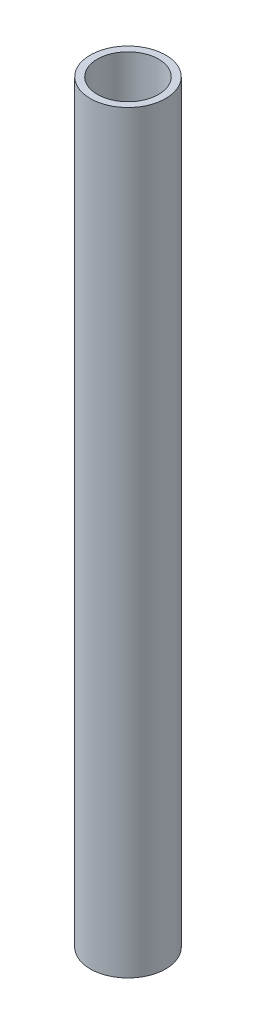
ISO-10303-21;
HEADER;
FILE_DESCRIPTION(('STEP AP214'),'2;1');
FILE_NAME('part.step','',(''),(''),'','','');
FILE_SCHEMA(('AUTOMOTIVE_DESIGN { 1 0 10303 214 1 1 1 1 }'));
ENDSEC;
DATA;
#1=APPLICATION_CONTEXT('core data for automotive mechanical design processes');
#2=APPLICATION_PROTOCOL_DEFINITION('international standard','automotive_design',2000,#1);
#3=PRODUCT_CONTEXT('',#1,'mechanical');
#4=PRODUCT('Part','Part','',(#3));
#5=PRODUCT_RELATED_PRODUCT_CATEGORY('part','',(#4));
#6=PRODUCT_DEFINITION_FORMATION('','',#4);
#7=PRODUCT_DEFINITION_CONTEXT('part definition',#1,'design');
#8=PRODUCT_DEFINITION('design','',#6,#7);
#9=PRODUCT_DEFINITION_SHAPE('','',#8);
#10=(LENGTH_UNIT() NAMED_UNIT(*) SI_UNIT(.MILLI.,.METRE.));
#11=(NAMED_UNIT(*) PLANE_ANGLE_UNIT() SI_UNIT($,.RADIAN.));
#12=(NAMED_UNIT(*) SI_UNIT($,.STERADIAN.) SOLID_ANGLE_UNIT());
#13=UNCERTAINTY_MEASURE_WITH_UNIT(LENGTH_MEASURE(1.E-05),#10,'distance_accuracy_value','');
#14=(GEOMETRIC_REPRESENTATION_CONTEXT(3) GLOBAL_UNCERTAINTY_ASSIGNED_CONTEXT((#13)) GLOBAL_UNIT_ASSIGNED_CONTEXT((#10,
#11,#12)) REPRESENTATION_CONTEXT('',''));
#15=CARTESIAN_POINT('',(0.,0.,0.));
#16=DIRECTION('',(0.,0.,1.));
#17=DIRECTION('',(1.,0.,0.));
#18=AXIS2_PLACEMENT_3D('',#15,#16,#17);
#19=CARTESIAN_POINT('',(0.,160.,0.));
#20=DIRECTION('',(0.,1.,0.));
#21=DIRECTION('',(0.,0.,1.));
#22=AXIS2_PLACEMENT_3D('',#19,#20,#21);
#23=PLANE('',#22);
#24=CARTESIAN_POINT('',(0.,160.,0.));
#25=DIRECTION('',(0.,1.,0.));
#26=DIRECTION('',(0.,0.,1.));
#27=AXIS2_PLACEMENT_3D('',#24,#25,#26);
#28=CIRCLE('',#27,8.);
#29=CARTESIAN_POINT('',(0.,160.,8.));
#30=VERTEX_POINT('',#29);
#31=EDGE_CURVE('E10',#30,#30,#28,.T.);
#32=ORIENTED_EDGE('',*,*,#31,.T.);
#33=EDGE_LOOP('',(#32));
#34=FACE_BOUND('',#33,.T.);
#35=CARTESIAN_POINT('',(0.,160.,0.));
#36=DIRECTION('',(0.,1.,0.));
#37=DIRECTION('',(0.,0.,1.));
#38=AXIS2_PLACEMENT_3D('',#35,#36,#37);
#39=CIRCLE('',#38,6.5);
#40=CARTESIAN_POINT('',(0.,160.,6.5));
#41=VERTEX_POINT('',#40);
#42=EDGE_CURVE('E50',#41,#41,#39,.T.);
#43=ORIENTED_EDGE('',*,*,#42,.F.);
#44=EDGE_LOOP('',(#43));
#45=FACE_BOUND('',#44,.T.);
#46=ADVANCED_FACE('F37',(#34,#45),#23,.T.);
#47=CARTESIAN_POINT('',(0.,0.,0.));
#48=DIRECTION('',(0.,1.,0.));
#49=DIRECTION('',(0.,0.,1.));
#50=AXIS2_PLACEMENT_3D('',#47,#48,#49);
#51=PLANE('',#50);
#52=CARTESIAN_POINT('',(0.,0.,0.));
#53=DIRECTION('',(0.,1.,0.));
#54=DIRECTION('',(0.,0.,1.));
#55=AXIS2_PLACEMENT_3D('',#52,#53,#54);
#56=CIRCLE('',#55,8.);
#57=CARTESIAN_POINT('',(0.,0.,8.));
#58=VERTEX_POINT('',#57);
#59=EDGE_CURVE('E41',#58,#58,#56,.T.);
#60=ORIENTED_EDGE('',*,*,#59,.F.);
#61=EDGE_LOOP('',(#60));
#62=FACE_BOUND('',#61,.T.);
#63=CARTESIAN_POINT('',(0.,0.,0.));
#64=DIRECTION('',(0.,1.,0.));
#65=DIRECTION('',(0.,0.,1.));
#66=AXIS2_PLACEMENT_3D('',#63,#64,#65);
#67=CIRCLE('',#66,6.5);
#68=CARTESIAN_POINT('',(0.,0.,6.5));
#69=VERTEX_POINT('',#68);
#70=EDGE_CURVE('E52',#69,#69,#67,.T.);
#71=ORIENTED_EDGE('',*,*,#70,.T.);
#72=EDGE_LOOP('',(#71));
#73=FACE_BOUND('',#72,.T.);
#74=ADVANCED_FACE('F64',(#62,#73),#51,.F.);
#75=CARTESIAN_POINT('',(0.,160.,0.));
#76=DIRECTION('',(0.,-1.,0.));
#77=DIRECTION('',(0.,0.,-1.));
#78=AXIS2_PLACEMENT_3D('',#75,#76,#77);
#79=CYLINDRICAL_SURFACE('',#78,8.);
#80=ORIENTED_EDGE('',*,*,#31,.F.);
#81=EDGE_LOOP('',(#80));
#82=FACE_BOUND('',#81,.T.);
#83=ORIENTED_EDGE('',*,*,#59,.T.);
#84=EDGE_LOOP('',(#83));
#85=FACE_BOUND('',#84,.T.);
#86=ADVANCED_FACE('F39',(#82,#85),#79,.T.);
#87=CARTESIAN_POINT('',(0.,160.,0.));
#88=DIRECTION('',(0.,-1.,0.));
#89=DIRECTION('',(0.,0.,-1.));
#90=AXIS2_PLACEMENT_3D('',#87,#88,#89);
#91=CYLINDRICAL_SURFACE('',#90,6.5);
#92=ORIENTED_EDGE('',*,*,#42,.T.);
#93=EDGE_LOOP('',(#92));
#94=FACE_BOUND('',#93,.T.);
#95=ORIENTED_EDGE('',*,*,#70,.F.);
#96=EDGE_LOOP('',(#95));
#97=FACE_BOUND('',#96,.T.);
#98=ADVANCED_FACE('F60',(#94,#97),#91,.F.);
#99=CLOSED_SHELL('',(#46,#74,#86,#98));
#100=MANIFOLD_SOLID_BREP('B2',#99);
#101=ADVANCED_BREP_SHAPE_REPRESENTATION('',(#18,#100),#14);
#102=SHAPE_DEFINITION_REPRESENTATION(#9,#101);
ENDSEC;
END-ISO-10303-21;
